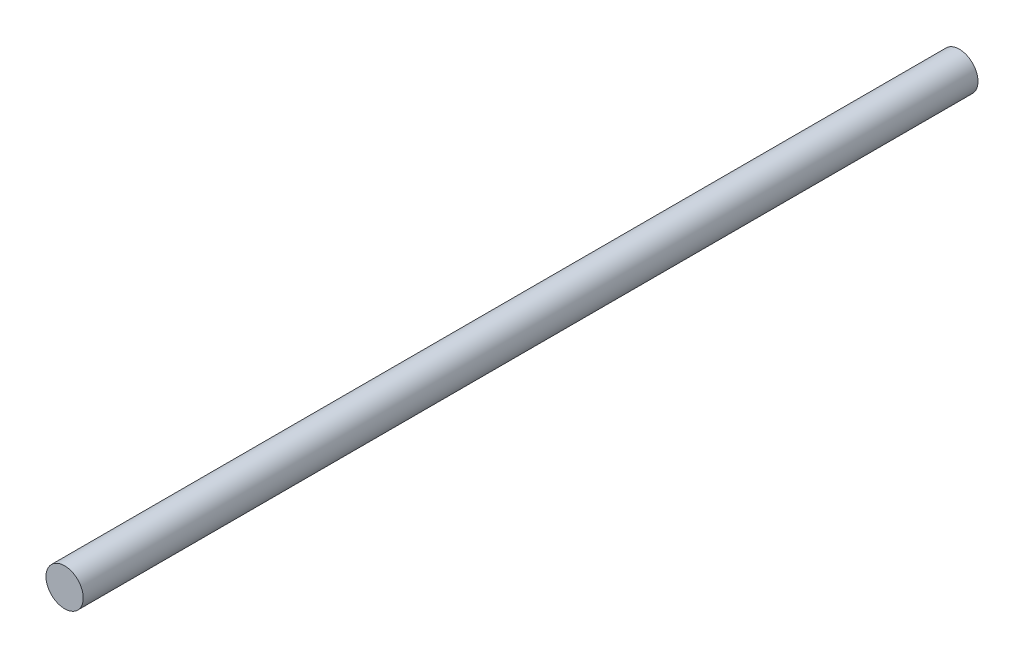
ISO-10303-21;
HEADER;
FILE_DESCRIPTION(('STEP AP214'),'2;1');
FILE_NAME('part.step','',(''),(''),'','','');
FILE_SCHEMA(('AUTOMOTIVE_DESIGN { 1 0 10303 214 1 1 1 1 }'));
ENDSEC;
DATA;
#1=APPLICATION_CONTEXT('core data for automotive mechanical design processes');
#2=APPLICATION_PROTOCOL_DEFINITION('international standard','automotive_design',2000,#1);
#3=PRODUCT_CONTEXT('',#1,'mechanical');
#4=PRODUCT('Part','Part','',(#3));
#5=PRODUCT_RELATED_PRODUCT_CATEGORY('part','',(#4));
#6=PRODUCT_DEFINITION_FORMATION('','',#4);
#7=PRODUCT_DEFINITION_CONTEXT('part definition',#1,'design');
#8=PRODUCT_DEFINITION('design','',#6,#7);
#9=PRODUCT_DEFINITION_SHAPE('','',#8);
#10=(LENGTH_UNIT() NAMED_UNIT(*) SI_UNIT(.MILLI.,.METRE.));
#11=(NAMED_UNIT(*) PLANE_ANGLE_UNIT() SI_UNIT($,.RADIAN.));
#12=(NAMED_UNIT(*) SI_UNIT($,.STERADIAN.) SOLID_ANGLE_UNIT());
#13=UNCERTAINTY_MEASURE_WITH_UNIT(LENGTH_MEASURE(1.E-05),#10,'distance_accuracy_value','');
#14=(GEOMETRIC_REPRESENTATION_CONTEXT(3) GLOBAL_UNCERTAINTY_ASSIGNED_CONTEXT((#13)) GLOBAL_UNIT_ASSIGNED_CONTEXT((#10,
#11,#12)) REPRESENTATION_CONTEXT('',''));
#15=CARTESIAN_POINT('',(0.,0.,0.));
#16=DIRECTION('',(0.,0.,1.));
#17=DIRECTION('',(1.,0.,0.));
#18=AXIS2_PLACEMENT_3D('',#15,#16,#17);
#19=CARTESIAN_POINT('',(0.,0.,-30.));
#20=DIRECTION('',(0.,0.,1.));
#21=DIRECTION('',(1.,0.,0.));
#22=AXIS2_PLACEMENT_3D('',#19,#20,#21);
#23=CYLINDRICAL_SURFACE('',#22,1.25);
#24=CARTESIAN_POINT('',(0.,0.,-30.));
#25=DIRECTION('',(0.,0.,1.));
#26=DIRECTION('',(1.,0.,0.));
#27=AXIS2_PLACEMENT_3D('',#24,#25,#26);
#28=CIRCLE('',#27,1.25);
#29=CARTESIAN_POINT('',(1.25,0.,-30.));
#30=VERTEX_POINT('',#29);
#31=EDGE_CURVE('E10',#30,#30,#28,.T.);
#32=ORIENTED_EDGE('',*,*,#31,.T.);
#33=EDGE_LOOP('',(#32));
#34=FACE_BOUND('',#33,.T.);
#35=CARTESIAN_POINT('',(0.,0.,30.));
#36=DIRECTION('',(0.,0.,1.));
#37=DIRECTION('',(1.,0.,0.));
#38=AXIS2_PLACEMENT_3D('',#35,#36,#37);
#39=CIRCLE('',#38,1.25);
#40=CARTESIAN_POINT('',(1.25,0.,30.));
#41=VERTEX_POINT('',#40);
#42=EDGE_CURVE('E44',#41,#41,#39,.T.);
#43=ORIENTED_EDGE('',*,*,#42,.F.);
#44=EDGE_LOOP('',(#43));
#45=FACE_BOUND('',#44,.T.);
#46=ADVANCED_FACE('F37',(#34,#45),#23,.T.);
#47=CARTESIAN_POINT('',(0.,0.,-30.));
#48=DIRECTION('',(0.,0.,1.));
#49=DIRECTION('',(1.,0.,0.));
#50=AXIS2_PLACEMENT_3D('',#47,#48,#49);
#51=PLANE('',#50);
#52=ORIENTED_EDGE('',*,*,#31,.F.);
#53=EDGE_LOOP('',(#52));
#54=FACE_BOUND('',#53,.T.);
#55=ADVANCED_FACE('F54',(#54),#51,.F.);
#56=CARTESIAN_POINT('',(0.,0.,30.));
#57=DIRECTION('',(0.,0.,1.));
#58=DIRECTION('',(1.,0.,0.));
#59=AXIS2_PLACEMENT_3D('',#56,#57,#58);
#60=PLANE('',#59);
#61=ORIENTED_EDGE('',*,*,#42,.T.);
#62=EDGE_LOOP('',(#61));
#63=FACE_BOUND('',#62,.T.);
#64=ADVANCED_FACE('F51',(#63),#60,.T.);
#65=CLOSED_SHELL('',(#46,#55,#64));
#66=MANIFOLD_SOLID_BREP('B2',#65);
#67=ADVANCED_BREP_SHAPE_REPRESENTATION('',(#18,#66),#14);
#68=SHAPE_DEFINITION_REPRESENTATION(#9,#67);
ENDSEC;
END-ISO-10303-21;
